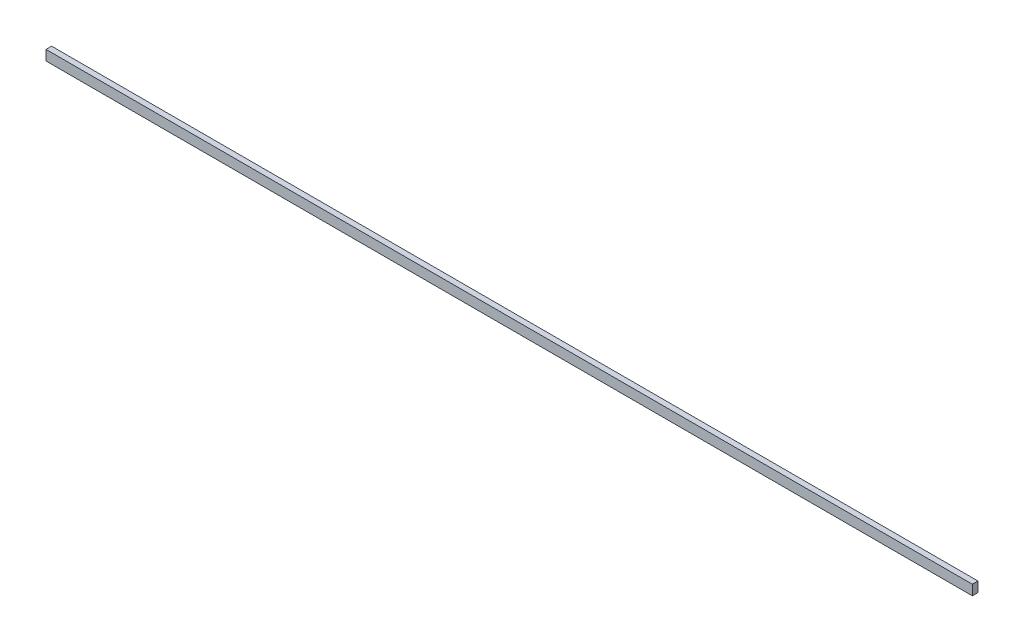
ISO-10303-21;
HEADER;
FILE_DESCRIPTION(('STEP AP214'),'2;1');
FILE_NAME('part.step','',(''),(''),'','','');
FILE_SCHEMA(('AUTOMOTIVE_DESIGN { 1 0 10303 214 1 1 1 1 }'));
ENDSEC;
DATA;
#1=APPLICATION_CONTEXT('core data for automotive mechanical design processes');
#2=APPLICATION_PROTOCOL_DEFINITION('international standard','automotive_design',2000,#1);
#3=PRODUCT_CONTEXT('',#1,'mechanical');
#4=PRODUCT('Part','Part','',(#3));
#5=PRODUCT_RELATED_PRODUCT_CATEGORY('part','',(#4));
#6=PRODUCT_DEFINITION_FORMATION('','',#4);
#7=PRODUCT_DEFINITION_CONTEXT('part definition',#1,'design');
#8=PRODUCT_DEFINITION('design','',#6,#7);
#9=PRODUCT_DEFINITION_SHAPE('','',#8);
#10=(LENGTH_UNIT() NAMED_UNIT(*) SI_UNIT(.MILLI.,.METRE.));
#11=(NAMED_UNIT(*) PLANE_ANGLE_UNIT() SI_UNIT($,.RADIAN.));
#12=(NAMED_UNIT(*) SI_UNIT($,.STERADIAN.) SOLID_ANGLE_UNIT());
#13=UNCERTAINTY_MEASURE_WITH_UNIT(LENGTH_MEASURE(1.E-05),#10,'distance_accuracy_value','');
#14=(GEOMETRIC_REPRESENTATION_CONTEXT(3) GLOBAL_UNCERTAINTY_ASSIGNED_CONTEXT((#13)) GLOBAL_UNIT_ASSIGNED_CONTEXT((#10,
#11,#12)) REPRESENTATION_CONTEXT('',''));
#15=CARTESIAN_POINT('',(0.,0.,0.));
#16=DIRECTION('',(0.,0.,1.));
#17=DIRECTION('',(1.,0.,0.));
#18=AXIS2_PLACEMENT_3D('',#15,#16,#17);
#19=CARTESIAN_POINT('',(230.599999999999,-2.50000000000009,1.4));
#20=DIRECTION('',(-1.,0.,0.));
#21=DIRECTION('',(0.,0.,1.));
#22=AXIS2_PLACEMENT_3D('',#19,#20,#21);
#23=PLANE('',#22);
#24=DIRECTION('',(0.,1.,0.));
#25=VECTOR('',#24,1.);
#26=CARTESIAN_POINT('',(230.599999999999,-2.50000000000009,-1.4));
#27=LINE('',#26,#25);
#28=CARTESIAN_POINT('',(230.599999999999,-2.50000000000009,-1.4));
#29=VERTEX_POINT('',#28);
#30=CARTESIAN_POINT('',(230.599999999999,2.50000000000008,-1.4));
#31=VERTEX_POINT('',#30);
#32=EDGE_CURVE('E96',#29,#31,#27,.T.);
#33=ORIENTED_EDGE('',*,*,#32,.T.);
#34=DIRECTION('',(0.,0.,-1.));
#35=VECTOR('',#34,1.);
#36=CARTESIAN_POINT('',(230.599999999999,2.50000000000008,1.4));
#37=LINE('',#36,#35);
#38=CARTESIAN_POINT('',(230.599999999999,2.50000000000008,1.4));
#39=VERTEX_POINT('',#38);
#40=EDGE_CURVE('E11',#39,#31,#37,.T.);
#41=ORIENTED_EDGE('',*,*,#40,.F.);
#42=DIRECTION('',(0.,1.,0.));
#43=VECTOR('',#42,1.);
#44=CARTESIAN_POINT('',(230.599999999999,-2.50000000000009,1.4));
#45=LINE('',#44,#43);
#46=CARTESIAN_POINT('',(230.599999999999,-2.50000000000009,1.4));
#47=VERTEX_POINT('',#46);
#48=EDGE_CURVE('E84',#47,#39,#45,.T.);
#49=ORIENTED_EDGE('',*,*,#48,.F.);
#50=DIRECTION('',(0.,0.,-1.));
#51=VECTOR('',#50,1.);
#52=CARTESIAN_POINT('',(230.599999999999,-2.50000000000009,1.4));
#53=LINE('',#52,#51);
#54=EDGE_CURVE('E92',#47,#29,#53,.T.);
#55=ORIENTED_EDGE('',*,*,#54,.T.);
#56=EDGE_LOOP('',(#33,#41,#49,#55));
#57=FACE_BOUND('',#56,.T.);
#58=ADVANCED_FACE('F33',(#57),#23,.F.);
#59=CARTESIAN_POINT('',(-230.600000000001,2.49999999999991,1.4));
#60=DIRECTION('',(0.,-1.,0.));
#61=DIRECTION('',(1.,0.,0.));
#62=AXIS2_PLACEMENT_3D('',#59,#60,#61);
#63=PLANE('',#62);
#64=DIRECTION('',(-1.,0.,0.));
#65=VECTOR('',#64,1.);
#66=CARTESIAN_POINT('',(-230.600000000001,2.49999999999991,-1.4));
#67=LINE('',#66,#65);
#68=CARTESIAN_POINT('',(-230.600000000001,2.49999999999991,-1.4));
#69=VERTEX_POINT('',#68);
#70=EDGE_CURVE('E88',#31,#69,#67,.T.);
#71=ORIENTED_EDGE('',*,*,#70,.T.);
#72=DIRECTION('',(0.,0.,-1.));
#73=VECTOR('',#72,1.);
#74=CARTESIAN_POINT('',(-230.600000000001,2.49999999999991,1.4));
#75=LINE('',#74,#73);
#76=CARTESIAN_POINT('',(-230.600000000001,2.49999999999991,1.4));
#77=VERTEX_POINT('',#76);
#78=EDGE_CURVE('E41',#77,#69,#75,.T.);
#79=ORIENTED_EDGE('',*,*,#78,.F.);
#80=DIRECTION('',(-1.,0.,0.));
#81=VECTOR('',#80,1.);
#82=CARTESIAN_POINT('',(-230.600000000001,2.49999999999991,1.4));
#83=LINE('',#82,#81);
#84=EDGE_CURVE('E79',#39,#77,#83,.T.);
#85=ORIENTED_EDGE('',*,*,#84,.F.);
#86=ORIENTED_EDGE('',*,*,#40,.T.);
#87=EDGE_LOOP('',(#71,#79,#85,#86));
#88=FACE_BOUND('',#87,.T.);
#89=ADVANCED_FACE('F87',(#88),#63,.F.);
#90=CARTESIAN_POINT('',(-230.600000000001,-2.50000000000009,1.4));
#91=DIRECTION('',(1.,0.,0.));
#92=DIRECTION('',(0.,0.,-1.));
#93=AXIS2_PLACEMENT_3D('',#90,#91,#92);
#94=PLANE('',#93);
#95=DIRECTION('',(0.,-1.,0.));
#96=VECTOR('',#95,1.);
#97=CARTESIAN_POINT('',(-230.600000000001,-2.50000000000009,-1.4));
#98=LINE('',#97,#96);
#99=CARTESIAN_POINT('',(-230.600000000001,-2.50000000000009,-1.4));
#100=VERTEX_POINT('',#99);
#101=EDGE_CURVE('E66',#69,#100,#98,.T.);
#102=ORIENTED_EDGE('',*,*,#101,.T.);
#103=DIRECTION('',(0.,0.,-1.));
#104=VECTOR('',#103,1.);
#105=CARTESIAN_POINT('',(-230.600000000001,-2.50000000000009,1.4));
#106=LINE('',#105,#104);
#107=CARTESIAN_POINT('',(-230.600000000001,-2.50000000000009,1.4));
#108=VERTEX_POINT('',#107);
#109=EDGE_CURVE('E89',#108,#100,#106,.T.);
#110=ORIENTED_EDGE('',*,*,#109,.F.);
#111=DIRECTION('',(0.,-1.,0.));
#112=VECTOR('',#111,1.);
#113=CARTESIAN_POINT('',(-230.600000000001,-2.50000000000009,1.4));
#114=LINE('',#113,#112);
#115=EDGE_CURVE('E82',#77,#108,#114,.T.);
#116=ORIENTED_EDGE('',*,*,#115,.F.);
#117=ORIENTED_EDGE('',*,*,#78,.T.);
#118=EDGE_LOOP('',(#102,#110,#116,#117));
#119=FACE_BOUND('',#118,.T.);
#120=ADVANCED_FACE('F90',(#119),#94,.F.);
#121=CARTESIAN_POINT('',(-230.600000000001,-2.50000000000009,1.4));
#122=DIRECTION('',(0.,1.,0.));
#123=DIRECTION('',(0.,0.,1.));
#124=AXIS2_PLACEMENT_3D('',#121,#122,#123);
#125=PLANE('',#124);
#126=DIRECTION('',(1.,0.,0.));
#127=VECTOR('',#126,1.);
#128=CARTESIAN_POINT('',(-230.600000000001,-2.50000000000009,-1.4));
#129=LINE('',#128,#127);
#130=EDGE_CURVE('E72',#100,#29,#129,.T.);
#131=ORIENTED_EDGE('',*,*,#130,.T.);
#132=ORIENTED_EDGE('',*,*,#54,.F.);
#133=DIRECTION('',(1.,0.,0.));
#134=VECTOR('',#133,1.);
#135=CARTESIAN_POINT('',(-230.600000000001,-2.50000000000009,1.4));
#136=LINE('',#135,#134);
#137=EDGE_CURVE('E49',#108,#47,#136,.T.);
#138=ORIENTED_EDGE('',*,*,#137,.F.);
#139=ORIENTED_EDGE('',*,*,#109,.T.);
#140=EDGE_LOOP('',(#131,#132,#138,#139));
#141=FACE_BOUND('',#140,.T.);
#142=ADVANCED_FACE('F103',(#141),#125,.F.);
#143=CARTESIAN_POINT('',(0.,0.,1.4));
#144=DIRECTION('',(0.,0.,-1.));
#145=DIRECTION('',(-1.,0.,0.));
#146=AXIS2_PLACEMENT_3D('',#143,#144,#145);
#147=PLANE('',#146);
#148=ORIENTED_EDGE('',*,*,#48,.T.);
#149=ORIENTED_EDGE('',*,*,#84,.T.);
#150=ORIENTED_EDGE('',*,*,#115,.T.);
#151=ORIENTED_EDGE('',*,*,#137,.T.);
#152=EDGE_LOOP('',(#148,#149,#150,#151));
#153=FACE_BOUND('',#152,.T.);
#154=ADVANCED_FACE('F80',(#153),#147,.F.);
#155=CARTESIAN_POINT('',(0.,0.,-1.4));
#156=DIRECTION('',(0.,0.,-1.));
#157=DIRECTION('',(-1.,0.,0.));
#158=AXIS2_PLACEMENT_3D('',#155,#156,#157);
#159=PLANE('',#158);
#160=ORIENTED_EDGE('',*,*,#32,.F.);
#161=ORIENTED_EDGE('',*,*,#130,.F.);
#162=ORIENTED_EDGE('',*,*,#101,.F.);
#163=ORIENTED_EDGE('',*,*,#70,.F.);
#164=EDGE_LOOP('',(#160,#161,#162,#163));
#165=FACE_BOUND('',#164,.T.);
#166=ADVANCED_FACE('F106',(#165),#159,.T.);
#167=CLOSED_SHELL('',(#58,#89,#120,#142,#154,#166));
#168=MANIFOLD_SOLID_BREP('B2',#167);
#169=ADVANCED_BREP_SHAPE_REPRESENTATION('',(#18,#168),#14);
#170=SHAPE_DEFINITION_REPRESENTATION(#9,#169);
ENDSEC;
END-ISO-10303-21;
